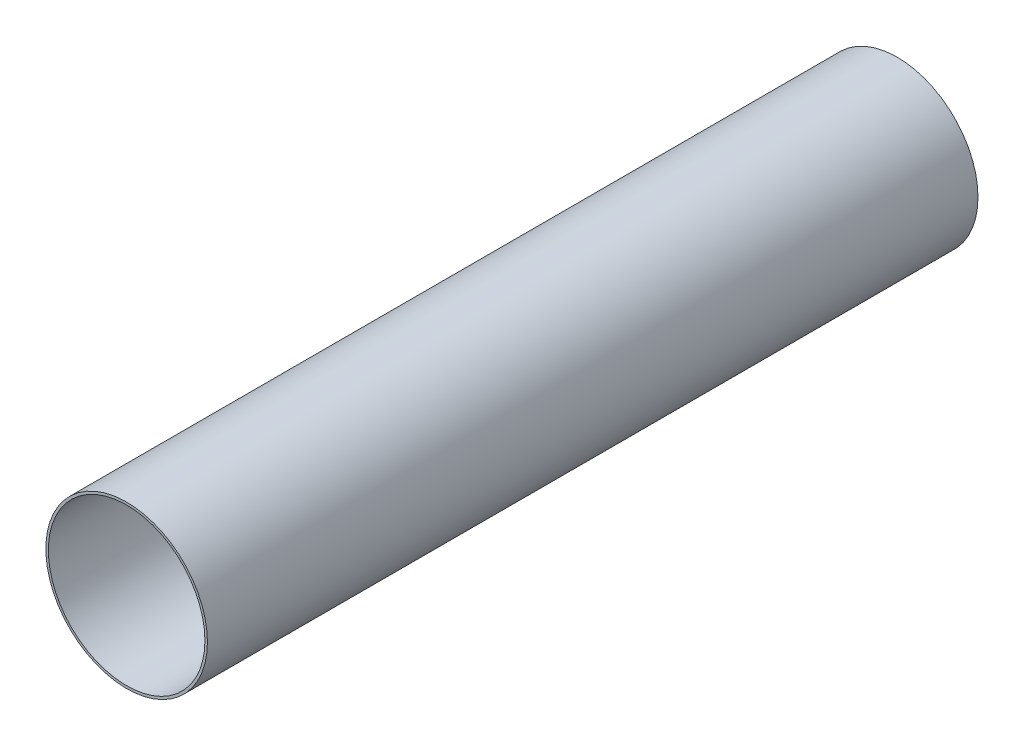
ISO-10303-21;
HEADER;
FILE_DESCRIPTION(('STEP AP214'),'2;1');
FILE_NAME('part.step','',(''),(''),'','','');
FILE_SCHEMA(('AUTOMOTIVE_DESIGN { 1 0 10303 214 1 1 1 1 }'));
ENDSEC;
DATA;
#1=APPLICATION_CONTEXT('core data for automotive mechanical design processes');
#2=APPLICATION_PROTOCOL_DEFINITION('international standard','automotive_design',2000,#1);
#3=PRODUCT_CONTEXT('',#1,'mechanical');
#4=PRODUCT('Part','Part','',(#3));
#5=PRODUCT_RELATED_PRODUCT_CATEGORY('part','',(#4));
#6=PRODUCT_DEFINITION_FORMATION('','',#4);
#7=PRODUCT_DEFINITION_CONTEXT('part definition',#1,'design');
#8=PRODUCT_DEFINITION('design','',#6,#7);
#9=PRODUCT_DEFINITION_SHAPE('','',#8);
#10=(LENGTH_UNIT() NAMED_UNIT(*) SI_UNIT(.MILLI.,.METRE.));
#11=(NAMED_UNIT(*) PLANE_ANGLE_UNIT() SI_UNIT($,.RADIAN.));
#12=(NAMED_UNIT(*) SI_UNIT($,.STERADIAN.) SOLID_ANGLE_UNIT());
#13=UNCERTAINTY_MEASURE_WITH_UNIT(LENGTH_MEASURE(1.E-05),#10,'distance_accuracy_value','');
#14=(GEOMETRIC_REPRESENTATION_CONTEXT(3) GLOBAL_UNCERTAINTY_ASSIGNED_CONTEXT((#13)) GLOBAL_UNIT_ASSIGNED_CONTEXT((#10,
#11,#12)) REPRESENTATION_CONTEXT('',''));
#15=CARTESIAN_POINT('',(0.,0.,0.));
#16=DIRECTION('',(0.,0.,1.));
#17=DIRECTION('',(1.,0.,0.));
#18=AXIS2_PLACEMENT_3D('',#15,#16,#17);
#19=CARTESIAN_POINT('',(0.,0.,310.));
#20=DIRECTION('',(0.,0.,1.));
#21=DIRECTION('',(1.,0.,0.));
#22=AXIS2_PLACEMENT_3D('',#19,#20,#21);
#23=PLANE('',#22);
#24=CARTESIAN_POINT('',(0.,0.,310.));
#25=DIRECTION('',(0.,0.,1.));
#26=DIRECTION('',(1.,0.,0.));
#27=AXIS2_PLACEMENT_3D('',#24,#25,#26);
#28=CIRCLE('',#27,32.5);
#29=CARTESIAN_POINT('',(32.5,0.,310.));
#30=VERTEX_POINT('',#29);
#31=EDGE_CURVE('E10',#30,#30,#28,.T.);
#32=ORIENTED_EDGE('',*,*,#31,.T.);
#33=EDGE_LOOP('',(#32));
#34=FACE_BOUND('',#33,.T.);
#35=CARTESIAN_POINT('',(0.,0.,310.));
#36=DIRECTION('',(0.,0.,1.));
#37=DIRECTION('',(1.,0.,0.));
#38=AXIS2_PLACEMENT_3D('',#35,#36,#37);
#39=CIRCLE('',#38,31.5);
#40=CARTESIAN_POINT('',(31.5,0.,310.));
#41=VERTEX_POINT('',#40);
#42=EDGE_CURVE('E50',#41,#41,#39,.T.);
#43=ORIENTED_EDGE('',*,*,#42,.F.);
#44=EDGE_LOOP('',(#43));
#45=FACE_BOUND('',#44,.T.);
#46=ADVANCED_FACE('F37',(#34,#45),#23,.T.);
#47=CARTESIAN_POINT('',(0.,0.,0.));
#48=DIRECTION('',(0.,0.,1.));
#49=DIRECTION('',(1.,0.,0.));
#50=AXIS2_PLACEMENT_3D('',#47,#48,#49);
#51=PLANE('',#50);
#52=CARTESIAN_POINT('',(0.,0.,0.));
#53=DIRECTION('',(0.,0.,1.));
#54=DIRECTION('',(1.,0.,0.));
#55=AXIS2_PLACEMENT_3D('',#52,#53,#54);
#56=CIRCLE('',#55,32.5);
#57=CARTESIAN_POINT('',(32.5,0.,0.));
#58=VERTEX_POINT('',#57);
#59=EDGE_CURVE('E41',#58,#58,#56,.T.);
#60=ORIENTED_EDGE('',*,*,#59,.F.);
#61=EDGE_LOOP('',(#60));
#62=FACE_BOUND('',#61,.T.);
#63=CARTESIAN_POINT('',(0.,0.,0.));
#64=DIRECTION('',(0.,0.,1.));
#65=DIRECTION('',(1.,0.,0.));
#66=AXIS2_PLACEMENT_3D('',#63,#64,#65);
#67=CIRCLE('',#66,31.5);
#68=CARTESIAN_POINT('',(31.5,0.,0.));
#69=VERTEX_POINT('',#68);
#70=EDGE_CURVE('E52',#69,#69,#67,.T.);
#71=ORIENTED_EDGE('',*,*,#70,.T.);
#72=EDGE_LOOP('',(#71));
#73=FACE_BOUND('',#72,.T.);
#74=ADVANCED_FACE('F64',(#62,#73),#51,.F.);
#75=CARTESIAN_POINT('',(0.,0.,310.));
#76=DIRECTION('',(0.,0.,-1.));
#77=DIRECTION('',(-1.,0.,0.));
#78=AXIS2_PLACEMENT_3D('',#75,#76,#77);
#79=CYLINDRICAL_SURFACE('',#78,32.5);
#80=ORIENTED_EDGE('',*,*,#31,.F.);
#81=EDGE_LOOP('',(#80));
#82=FACE_BOUND('',#81,.T.);
#83=ORIENTED_EDGE('',*,*,#59,.T.);
#84=EDGE_LOOP('',(#83));
#85=FACE_BOUND('',#84,.T.);
#86=ADVANCED_FACE('F39',(#82,#85),#79,.T.);
#87=CARTESIAN_POINT('',(0.,0.,310.));
#88=DIRECTION('',(0.,0.,-1.));
#89=DIRECTION('',(-1.,0.,0.));
#90=AXIS2_PLACEMENT_3D('',#87,#88,#89);
#91=CYLINDRICAL_SURFACE('',#90,31.5);
#92=ORIENTED_EDGE('',*,*,#42,.T.);
#93=EDGE_LOOP('',(#92));
#94=FACE_BOUND('',#93,.T.);
#95=ORIENTED_EDGE('',*,*,#70,.F.);
#96=EDGE_LOOP('',(#95));
#97=FACE_BOUND('',#96,.T.);
#98=ADVANCED_FACE('F60',(#94,#97),#91,.F.);
#99=CLOSED_SHELL('',(#46,#74,#86,#98));
#100=MANIFOLD_SOLID_BREP('B2',#99);
#101=ADVANCED_BREP_SHAPE_REPRESENTATION('',(#18,#100),#14);
#102=SHAPE_DEFINITION_REPRESENTATION(#9,#101);
ENDSEC;
END-ISO-10303-21;
